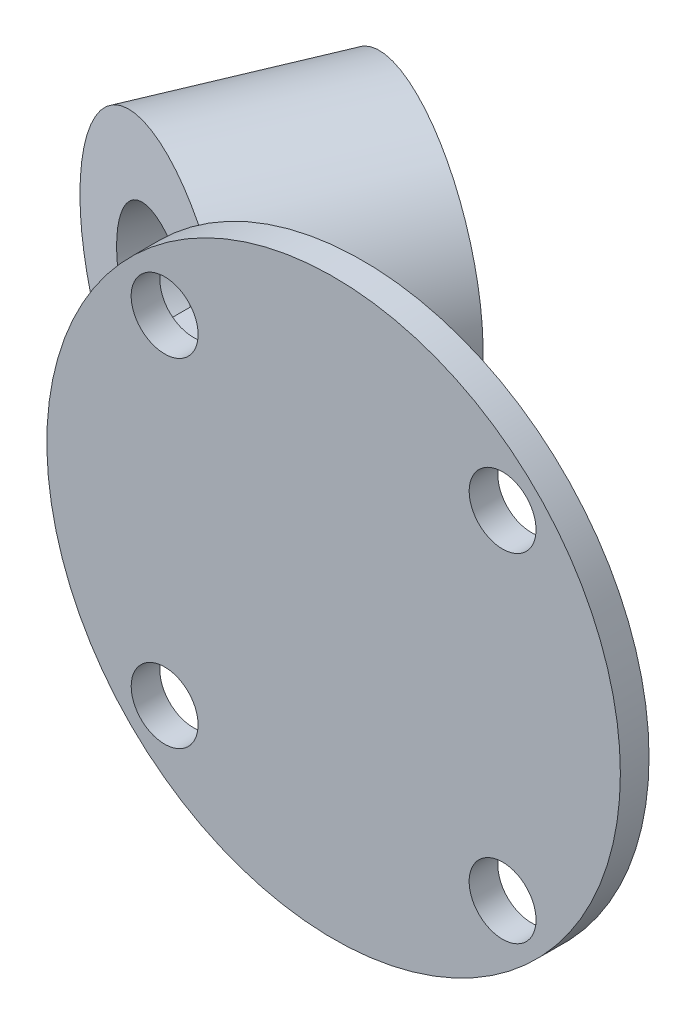
ISO-10303-21;
HEADER;
FILE_DESCRIPTION(('STEP AP214'),'2;1');
FILE_NAME('part.step','',(''),(''),'','','');
FILE_SCHEMA(('AUTOMOTIVE_DESIGN { 1 0 10303 214 1 1 1 1 }'));
ENDSEC;
DATA;
#1=APPLICATION_CONTEXT('core data for automotive mechanical design processes');
#2=APPLICATION_PROTOCOL_DEFINITION('international standard','automotive_design',2000,#1);
#3=PRODUCT_CONTEXT('',#1,'mechanical');
#4=PRODUCT('Part','Part','',(#3));
#5=PRODUCT_RELATED_PRODUCT_CATEGORY('part','',(#4));
#6=PRODUCT_DEFINITION_FORMATION('','',#4);
#7=PRODUCT_DEFINITION_CONTEXT('part definition',#1,'design');
#8=PRODUCT_DEFINITION('design','',#6,#7);
#9=PRODUCT_DEFINITION_SHAPE('','',#8);
#10=(LENGTH_UNIT() NAMED_UNIT(*) SI_UNIT(.MILLI.,.METRE.));
#11=(NAMED_UNIT(*) PLANE_ANGLE_UNIT() SI_UNIT($,.RADIAN.));
#12=(NAMED_UNIT(*) SI_UNIT($,.STERADIAN.) SOLID_ANGLE_UNIT());
#13=UNCERTAINTY_MEASURE_WITH_UNIT(LENGTH_MEASURE(1.E-05),#10,'distance_accuracy_value','');
#14=(GEOMETRIC_REPRESENTATION_CONTEXT(3) GLOBAL_UNCERTAINTY_ASSIGNED_CONTEXT((#13)) GLOBAL_UNIT_ASSIGNED_CONTEXT((#10,
#11,#12)) REPRESENTATION_CONTEXT('',''));
#15=CARTESIAN_POINT('',(0.,0.,0.));
#16=DIRECTION('',(0.,0.,1.));
#17=DIRECTION('',(1.,0.,0.));
#18=AXIS2_PLACEMENT_3D('',#15,#16,#17);
#19=CARTESIAN_POINT('',(-21.1807300401859,5.,-14.1666666666666));
#20=DIRECTION('',(-0.388888888888892,0.,0.92128466398761));
#21=DIRECTION('',(0.92128466398761,0.,0.388888888888892));
#22=AXIS2_PLACEMENT_3D('',#19,#20,#21);
#23=PLANE('',#22);
#24=CARTESIAN_POINT('',(-35.,0.,-20.));
#25=DIRECTION('',(-0.388888888888892,0.,0.92128466398761));
#26=DIRECTION('',(0.92128466398761,0.,0.388888888888892));
#27=AXIS2_PLACEMENT_3D('',#24,#25,#26);
#28=CIRCLE('',#27,15.);
#29=CARTESIAN_POINT('',(-21.1807300401858,0.,-14.1666666666666));
#30=VERTEX_POINT('',#29);
#31=CARTESIAN_POINT('',(-21.9710673338238,-5.,-14.5002805907713));
#32=VERTEX_POINT('',#31);
#33=EDGE_CURVE('E55',#30,#32,#28,.F.);
#34=ORIENTED_EDGE('',*,*,#33,.F.);
#35=DIRECTION('',(0.,-1.,0.));
#36=VECTOR('',#35,1.);
#37=CARTESIAN_POINT('',(-21.1807300401859,5.,-14.1666666666666));
#38=LINE('',#37,#36);
#39=CARTESIAN_POINT('',(-21.1807300401859,-5.,-14.1666666666666));
#40=VERTEX_POINT('',#39);
#41=EDGE_CURVE('E157',#30,#40,#38,.T.);
#42=ORIENTED_EDGE('',*,*,#41,.T.);
#43=DIRECTION('',(-0.92128466398761,0.,-0.388888888888892));
#44=VECTOR('',#43,1.);
#45=CARTESIAN_POINT('',(-21.1807300401859,-5.,-14.1666666666666));
#46=LINE('',#45,#44);
#47=EDGE_CURVE('E147',#40,#32,#46,.T.);
#48=ORIENTED_EDGE('',*,*,#47,.T.);
#49=EDGE_LOOP('',(#34,#42,#48));
#50=FACE_BOUND('',#49,.T.);
#51=ADVANCED_FACE('F39',(#50),#23,.F.);
#52=CARTESIAN_POINT('',(0.,5.,0.));
#53=DIRECTION('',(0.,-1.,0.));
#54=DIRECTION('',(0.,0.,-1.));
#55=AXIS2_PLACEMENT_3D('',#52,#53,#54);
#56=PLANE('',#55);
#57=DIRECTION('',(0.92128466398761,0.,0.388888888888891));
#58=VECTOR('',#57,1.);
#59=CARTESIAN_POINT('',(-0.0721069344173931,5.,0.170822604460897));
#60=LINE('',#59,#58);
#61=CARTESIAN_POINT('',(-29.7584240653411,5.,-12.3602433467286));
#62=VERTEX_POINT('',#61);
#63=CARTESIAN_POINT('',(-23.9155117782683,5.,-9.8938572708332));
#64=VERTEX_POINT('',#63);
#65=EDGE_CURVE('E111',#62,#64,#60,.T.);
#66=ORIENTED_EDGE('',*,*,#65,.F.);
#67=DIRECTION('',(0.,0.,1.));
#68=VECTOR('',#67,1.);
#69=CARTESIAN_POINT('',(-29.7584240653411,5.,-12.3602433467286));
#70=LINE('',#69,#68);
#71=CARTESIAN_POINT('',(-29.7584240653411,5.,0.));
#72=VERTEX_POINT('',#71);
#73=EDGE_CURVE('E143',#62,#72,#70,.T.);
#74=ORIENTED_EDGE('',*,*,#73,.T.);
#75=DIRECTION('',(1.,0.,0.));
#76=VECTOR('',#75,1.);
#77=CARTESIAN_POINT('',(-29.7584240653411,5.,0.));
#78=LINE('',#77,#76);
#79=CARTESIAN_POINT('',(-29.5803989154981,5.,0.));
#80=VERTEX_POINT('',#79);
#81=EDGE_CURVE('E146',#72,#80,#78,.T.);
#82=ORIENTED_EDGE('',*,*,#81,.T.);
#83=CARTESIAN_POINT('',(0.,5.,0.));
#84=VERTEX_POINT('',#83);
#85=EDGE_CURVE('E152',#80,#84,#78,.T.);
#86=ORIENTED_EDGE('',*,*,#85,.T.);
#87=DIRECTION('',(-0.831212911973444,0.,-0.555954220209388));
#88=VECTOR('',#87,1.);
#89=CARTESIAN_POINT('',(0.,5.,0.));
#90=LINE('',#89,#88);
#91=CARTESIAN_POINT('',(-21.1807300401859,5.,-14.1666666666666));
#92=VERTEX_POINT('',#91);
#93=EDGE_CURVE('E151',#84,#92,#90,.T.);
#94=ORIENTED_EDGE('',*,*,#93,.T.);
#95=DIRECTION('',(-0.92128466398761,0.,-0.388888888888892));
#96=VECTOR('',#95,1.);
#97=CARTESIAN_POINT('',(-21.1807300401859,5.,-14.1666666666666));
#98=LINE('',#97,#96);
#99=CARTESIAN_POINT('',(-21.9710673338238,5.,-14.5002805907713));
#100=VERTEX_POINT('',#99);
#101=EDGE_CURVE('E134',#92,#100,#98,.T.);
#102=ORIENTED_EDGE('',*,*,#101,.T.);
#103=DIRECTION('',(0.388888888888891,0.,-0.92128466398761));
#104=VECTOR('',#103,1.);
#105=CARTESIAN_POINT('',(-21.9710673338238,5.,-14.5002805907713));
#106=LINE('',#105,#104);
#107=EDGE_CURVE('E126',#64,#100,#106,.T.);
#108=ORIENTED_EDGE('',*,*,#107,.F.);
#109=EDGE_LOOP('',(#66,#74,#82,#86,#94,#102,#108));
#110=FACE_BOUND('',#109,.T.);
#111=ADVANCED_FACE('F132',(#110),#56,.F.);
#112=CARTESIAN_POINT('',(0.,-5.,0.));
#113=DIRECTION('',(0.,-1.,0.));
#114=DIRECTION('',(0.,0.,-1.));
#115=AXIS2_PLACEMENT_3D('',#112,#113,#114);
#116=PLANE('',#115);
#117=DIRECTION('',(0.,0.,1.));
#118=VECTOR('',#117,1.);
#119=CARTESIAN_POINT('',(-29.7584240653411,-5.,-12.3602433467286));
#120=LINE('',#119,#118);
#121=CARTESIAN_POINT('',(-29.7584240653411,-5.,-12.3602433467286));
#122=VERTEX_POINT('',#121);
#123=CARTESIAN_POINT('',(-29.7584240653411,-5.,0.));
#124=VERTEX_POINT('',#123);
#125=EDGE_CURVE('E122',#122,#124,#120,.T.);
#126=ORIENTED_EDGE('',*,*,#125,.F.);
#127=DIRECTION('',(0.92128466398761,0.,0.388888888888891));
#128=VECTOR('',#127,1.);
#129=CARTESIAN_POINT('',(-0.0721069344173931,-5.,0.170822604460897));
#130=LINE('',#129,#128);
#131=CARTESIAN_POINT('',(-23.9155117782683,-5.,-9.8938572708332));
#132=VERTEX_POINT('',#131);
#133=EDGE_CURVE('E11',#122,#132,#130,.T.);
#134=ORIENTED_EDGE('',*,*,#133,.T.);
#135=DIRECTION('',(0.388888888888891,0.,-0.92128466398761));
#136=VECTOR('',#135,1.);
#137=CARTESIAN_POINT('',(-21.9710673338238,-5.,-14.5002805907713));
#138=LINE('',#137,#136);
#139=EDGE_CURVE('E48',#132,#32,#138,.T.);
#140=ORIENTED_EDGE('',*,*,#139,.T.);
#141=ORIENTED_EDGE('',*,*,#47,.F.);
#142=DIRECTION('',(-0.831212911973444,0.,-0.555954220209388));
#143=VECTOR('',#142,1.);
#144=CARTESIAN_POINT('',(0.,-5.,0.));
#145=LINE('',#144,#143);
#146=CARTESIAN_POINT('',(0.,-5.,0.));
#147=VERTEX_POINT('',#146);
#148=EDGE_CURVE('E164',#147,#40,#145,.T.);
#149=ORIENTED_EDGE('',*,*,#148,.F.);
#150=DIRECTION('',(1.,0.,0.));
#151=VECTOR('',#150,1.);
#152=CARTESIAN_POINT('',(-29.7584240653411,-5.,0.));
#153=LINE('',#152,#151);
#154=CARTESIAN_POINT('',(-29.5803989154981,-5.,0.));
#155=VERTEX_POINT('',#154);
#156=EDGE_CURVE('E165',#155,#147,#153,.T.);
#157=ORIENTED_EDGE('',*,*,#156,.F.);
#158=EDGE_CURVE('E160',#124,#155,#153,.T.);
#159=ORIENTED_EDGE('',*,*,#158,.F.);
#160=EDGE_LOOP('',(#126,#134,#140,#141,#149,#157,#159));
#161=FACE_BOUND('',#160,.T.);
#162=ADVANCED_FACE('F252',(#161),#116,.T.);
#163=CARTESIAN_POINT('',(0.,0.,0.));
#164=DIRECTION('',(0.,0.,1.));
#165=DIRECTION('',(1.,0.,0.));
#166=AXIS2_PLACEMENT_3D('',#163,#164,#165);
#167=PLANE('',#166);
#168=CARTESIAN_POINT('',(-17.6776695296637,17.6776695296637,0.));
#169=DIRECTION('',(0.,0.,1.));
#170=DIRECTION('',(1.,0.,0.));
#171=AXIS2_PLACEMENT_3D('',#168,#169,#170);
#172=CIRCLE('',#171,3.5);
#173=CARTESIAN_POINT('',(-14.1776695296637,17.6776695296637,0.));
#174=VERTEX_POINT('',#173);
#175=EDGE_CURVE('E211',#174,#174,#172,.T.);
#176=ORIENTED_EDGE('',*,*,#175,.T.);
#177=EDGE_LOOP('',(#176));
#178=FACE_BOUND('',#177,.T.);
#179=CARTESIAN_POINT('',(17.6776695296637,17.6776695296637,0.));
#180=DIRECTION('',(0.,0.,1.));
#181=DIRECTION('',(-1.,0.,0.));
#182=AXIS2_PLACEMENT_3D('',#179,#180,#181);
#183=CIRCLE('',#182,3.5);
#184=CARTESIAN_POINT('',(14.1776695296637,17.6776695296637,0.));
#185=VERTEX_POINT('',#184);
#186=EDGE_CURVE('E187',#185,#185,#183,.T.);
#187=ORIENTED_EDGE('',*,*,#186,.T.);
#188=EDGE_LOOP('',(#187));
#189=FACE_BOUND('',#188,.T.);
#190=CARTESIAN_POINT('',(17.6776695296637,-17.6776695296637,0.));
#191=DIRECTION('',(0.,0.,1.));
#192=DIRECTION('',(1.,0.,0.));
#193=AXIS2_PLACEMENT_3D('',#190,#191,#192);
#194=CIRCLE('',#193,3.5);
#195=CARTESIAN_POINT('',(21.1776695296637,-17.6776695296637,0.));
#196=VERTEX_POINT('',#195);
#197=EDGE_CURVE('E196',#196,#196,#194,.T.);
#198=ORIENTED_EDGE('',*,*,#197,.T.);
#199=EDGE_LOOP('',(#198));
#200=FACE_BOUND('',#199,.T.);
#201=CARTESIAN_POINT('',(-17.6776695296637,-17.6776695296637,0.));
#202=DIRECTION('',(0.,0.,1.));
#203=DIRECTION('',(-1.,0.,0.));
#204=AXIS2_PLACEMENT_3D('',#201,#202,#203);
#205=CIRCLE('',#204,3.5);
#206=CARTESIAN_POINT('',(-21.1776695296637,-17.6776695296637,0.));
#207=VERTEX_POINT('',#206);
#208=EDGE_CURVE('E204',#207,#207,#205,.T.);
#209=ORIENTED_EDGE('',*,*,#208,.T.);
#210=EDGE_LOOP('',(#209));
#211=FACE_BOUND('',#210,.T.);
#212=CARTESIAN_POINT('',(0.,0.,0.));
#213=DIRECTION('',(0.,0.,1.));
#214=DIRECTION('',(1.,0.,0.));
#215=AXIS2_PLACEMENT_3D('',#212,#213,#214);
#216=CIRCLE('',#215,30.);
#217=EDGE_CURVE('E215',#155,#80,#216,.T.);
#218=ORIENTED_EDGE('',*,*,#217,.F.);
#219=ORIENTED_EDGE('',*,*,#156,.T.);
#220=DIRECTION('',(0.,-1.,0.));
#221=VECTOR('',#220,1.);
#222=CARTESIAN_POINT('',(0.,5.,0.));
#223=LINE('',#222,#221);
#224=EDGE_CURVE('E176',#84,#147,#223,.T.);
#225=ORIENTED_EDGE('',*,*,#224,.F.);
#226=ORIENTED_EDGE('',*,*,#85,.F.);
#227=EDGE_LOOP('',(#218,#219,#225,#226));
#228=FACE_BOUND('',#227,.T.);
#229=ADVANCED_FACE('F258',(#178,#189,#200,#211,#228),#167,.F.);
#230=CARTESIAN_POINT('',(0.,0.,3.));
#231=DIRECTION('',(0.,0.,-1.));
#232=DIRECTION('',(-1.,0.,0.));
#233=AXIS2_PLACEMENT_3D('',#230,#231,#232);
#234=CYLINDRICAL_SURFACE('',#233,30.);
#235=CARTESIAN_POINT('',(0.,0.,3.));
#236=DIRECTION('',(0.,0.,1.));
#237=DIRECTION('',(1.,0.,0.));
#238=AXIS2_PLACEMENT_3D('',#235,#236,#237);
#239=CIRCLE('',#238,30.);
#240=CARTESIAN_POINT('',(30.,0.,3.));
#241=VERTEX_POINT('',#240);
#242=EDGE_CURVE('E219',#241,#241,#239,.T.);
#243=ORIENTED_EDGE('',*,*,#242,.F.);
#244=EDGE_LOOP('',(#243));
#245=FACE_BOUND('',#244,.T.);
#246=CARTESIAN_POINT('',(-29.7584240653411,3.79949959169974,0.));
#247=VERTEX_POINT('',#246);
#248=EDGE_CURVE('E223',#80,#247,#216,.T.);
#249=ORIENTED_EDGE('',*,*,#248,.T.);
#250=CARTESIAN_POINT('',(-29.7584240653411,-3.79949959169974,0.));
#251=VERTEX_POINT('',#250);
#252=EDGE_CURVE('E226',#247,#251,#216,.T.);
#253=ORIENTED_EDGE('',*,*,#252,.T.);
#254=EDGE_CURVE('E248',#251,#155,#216,.T.);
#255=ORIENTED_EDGE('',*,*,#254,.T.);
#256=ORIENTED_EDGE('',*,*,#217,.T.);
#257=EDGE_LOOP('',(#249,#253,#255,#256));
#258=FACE_BOUND('',#257,.T.);
#259=ADVANCED_FACE('F41',(#245,#258),#234,.T.);
#260=CARTESIAN_POINT('',(0.,0.,3.));
#261=DIRECTION('',(0.,0.,1.));
#262=DIRECTION('',(1.,0.,0.));
#263=AXIS2_PLACEMENT_3D('',#260,#261,#262);
#264=PLANE('',#263);
#265=CARTESIAN_POINT('',(-17.6776695296637,-17.6776695296637,3.));
#266=DIRECTION('',(0.,0.,1.));
#267=DIRECTION('',(-1.,0.,0.));
#268=AXIS2_PLACEMENT_3D('',#265,#266,#267);
#269=CIRCLE('',#268,3.5);
#270=CARTESIAN_POINT('',(-21.1776695296637,-17.6776695296637,3.));
#271=VERTEX_POINT('',#270);
#272=EDGE_CURVE('E186',#271,#271,#269,.T.);
#273=ORIENTED_EDGE('',*,*,#272,.F.);
#274=EDGE_LOOP('',(#273));
#275=FACE_BOUND('',#274,.T.);
#276=CARTESIAN_POINT('',(17.6776695296637,-17.6776695296637,3.));
#277=DIRECTION('',(0.,0.,1.));
#278=DIRECTION('',(1.,0.,0.));
#279=AXIS2_PLACEMENT_3D('',#276,#277,#278);
#280=CIRCLE('',#279,3.5);
#281=CARTESIAN_POINT('',(21.1776695296637,-17.6776695296637,3.));
#282=VERTEX_POINT('',#281);
#283=EDGE_CURVE('E200',#282,#282,#280,.T.);
#284=ORIENTED_EDGE('',*,*,#283,.F.);
#285=EDGE_LOOP('',(#284));
#286=FACE_BOUND('',#285,.T.);
#287=CARTESIAN_POINT('',(17.6776695296637,17.6776695296637,3.));
#288=DIRECTION('',(0.,0.,1.));
#289=DIRECTION('',(-1.,0.,0.));
#290=AXIS2_PLACEMENT_3D('',#287,#288,#289);
#291=CIRCLE('',#290,3.5);
#292=CARTESIAN_POINT('',(14.1776695296637,17.6776695296637,3.));
#293=VERTEX_POINT('',#292);
#294=EDGE_CURVE('E192',#293,#293,#291,.T.);
#295=ORIENTED_EDGE('',*,*,#294,.F.);
#296=EDGE_LOOP('',(#295));
#297=FACE_BOUND('',#296,.T.);
#298=CARTESIAN_POINT('',(-17.6776695296637,17.6776695296637,3.));
#299=DIRECTION('',(0.,0.,1.));
#300=DIRECTION('',(1.,0.,0.));
#301=AXIS2_PLACEMENT_3D('',#298,#299,#300);
#302=CIRCLE('',#301,3.5);
#303=CARTESIAN_POINT('',(-14.1776695296637,17.6776695296637,3.));
#304=VERTEX_POINT('',#303);
#305=EDGE_CURVE('E191',#304,#304,#302,.T.);
#306=ORIENTED_EDGE('',*,*,#305,.F.);
#307=EDGE_LOOP('',(#306));
#308=FACE_BOUND('',#307,.T.);
#309=ORIENTED_EDGE('',*,*,#242,.T.);
#310=EDGE_LOOP('',(#309));
#311=FACE_BOUND('',#310,.T.);
#312=ADVANCED_FACE('F267',(#275,#286,#297,#308,#311),#264,.T.);
#313=ORIENTED_EDGE('',*,*,#252,.F.);
#314=DIRECTION('',(0.,-1.,0.));
#315=VECTOR('',#314,1.);
#316=CARTESIAN_POINT('',(-29.7584240653411,5.,0.));
#317=LINE('',#316,#315);
#318=EDGE_CURVE('E183',#247,#251,#317,.T.);
#319=ORIENTED_EDGE('',*,*,#318,.T.);
#320=EDGE_LOOP('',(#313,#319));
#321=FACE_BOUND('',#320,.T.);
#322=ADVANCED_FACE('F264',(#321),#167,.F.);
#323=CARTESIAN_POINT('',(-17.6776695296637,17.6776695296637,0.));
#324=DIRECTION('',(0.,0.,1.));
#325=DIRECTION('',(1.,0.,0.));
#326=AXIS2_PLACEMENT_3D('',#323,#324,#325);
#327=CYLINDRICAL_SURFACE('',#326,3.5);
#328=ORIENTED_EDGE('',*,*,#175,.F.);
#329=EDGE_LOOP('',(#328));
#330=FACE_BOUND('',#329,.T.);
#331=ORIENTED_EDGE('',*,*,#305,.T.);
#332=EDGE_LOOP('',(#331));
#333=FACE_BOUND('',#332,.T.);
#334=ADVANCED_FACE('F266',(#330,#333),#327,.F.);
#335=CARTESIAN_POINT('',(17.6776695296637,17.6776695296637,0.));
#336=DIRECTION('',(0.,0.,1.));
#337=DIRECTION('',(1.,0.,0.));
#338=AXIS2_PLACEMENT_3D('',#335,#336,#337);
#339=CYLINDRICAL_SURFACE('',#338,3.5);
#340=ORIENTED_EDGE('',*,*,#186,.F.);
#341=EDGE_LOOP('',(#340));
#342=FACE_BOUND('',#341,.T.);
#343=ORIENTED_EDGE('',*,*,#294,.T.);
#344=EDGE_LOOP('',(#343));
#345=FACE_BOUND('',#344,.T.);
#346=ADVANCED_FACE('F272',(#342,#345),#339,.F.);
#347=CARTESIAN_POINT('',(17.6776695296637,-17.6776695296637,0.));
#348=DIRECTION('',(0.,0.,1.));
#349=DIRECTION('',(1.,0.,0.));
#350=AXIS2_PLACEMENT_3D('',#347,#348,#349);
#351=CYLINDRICAL_SURFACE('',#350,3.5);
#352=ORIENTED_EDGE('',*,*,#197,.F.);
#353=EDGE_LOOP('',(#352));
#354=FACE_BOUND('',#353,.T.);
#355=ORIENTED_EDGE('',*,*,#283,.T.);
#356=EDGE_LOOP('',(#355));
#357=FACE_BOUND('',#356,.T.);
#358=ADVANCED_FACE('F323',(#354,#357),#351,.F.);
#359=CARTESIAN_POINT('',(-17.6776695296637,-17.6776695296637,0.));
#360=DIRECTION('',(0.,0.,1.));
#361=DIRECTION('',(1.,0.,0.));
#362=AXIS2_PLACEMENT_3D('',#359,#360,#361);
#363=CYLINDRICAL_SURFACE('',#362,3.5);
#364=ORIENTED_EDGE('',*,*,#208,.F.);
#365=EDGE_LOOP('',(#364));
#366=FACE_BOUND('',#365,.T.);
#367=ORIENTED_EDGE('',*,*,#272,.T.);
#368=EDGE_LOOP('',(#367));
#369=FACE_BOUND('',#368,.T.);
#370=ADVANCED_FACE('F316',(#366,#369),#363,.F.);
#371=CARTESIAN_POINT('',(-29.7584240653411,5.,0.));
#372=DIRECTION('',(0.,0.,-1.));
#373=DIRECTION('',(-1.,0.,0.));
#374=AXIS2_PLACEMENT_3D('',#371,#372,#373);
#375=PLANE('',#374);
#376=ORIENTED_EDGE('',*,*,#248,.F.);
#377=ORIENTED_EDGE('',*,*,#81,.F.);
#378=EDGE_CURVE('E179',#72,#247,#317,.T.);
#379=ORIENTED_EDGE('',*,*,#378,.T.);
#380=EDGE_LOOP('',(#376,#377,#379));
#381=FACE_BOUND('',#380,.T.);
#382=ADVANCED_FACE('F314',(#381),#375,.F.);
#383=CARTESIAN_POINT('',(-29.7584240653411,5.,-12.3602433467286));
#384=DIRECTION('',(1.,0.,0.));
#385=DIRECTION('',(0.,0.,-1.));
#386=AXIS2_PLACEMENT_3D('',#383,#384,#385);
#387=PLANE('',#386);
#388=ORIENTED_EDGE('',*,*,#125,.T.);
#389=EDGE_CURVE('E63',#251,#124,#317,.T.);
#390=ORIENTED_EDGE('',*,*,#389,.F.);
#391=ORIENTED_EDGE('',*,*,#318,.F.);
#392=ORIENTED_EDGE('',*,*,#378,.F.);
#393=ORIENTED_EDGE('',*,*,#73,.F.);
#394=DIRECTION('',(0.,-1.,0.));
#395=VECTOR('',#394,1.);
#396=CARTESIAN_POINT('',(-29.7584240653411,5.,-12.3602433467286));
#397=LINE('',#396,#395);
#398=CARTESIAN_POINT('',(-29.7584240653411,0.,-12.3602433467286));
#399=VERTEX_POINT('',#398);
#400=EDGE_CURVE('E117',#62,#399,#397,.T.);
#401=ORIENTED_EDGE('',*,*,#400,.T.);
#402=DIRECTION('',(0.,1.,0.));
#403=VECTOR('',#402,1.);
#404=CARTESIAN_POINT('',(-29.7584240653411,5.,-12.3602433467286));
#405=LINE('',#404,#403);
#406=EDGE_CURVE('E123',#122,#399,#405,.T.);
#407=ORIENTED_EDGE('',*,*,#406,.F.);
#408=EDGE_LOOP('',(#388,#390,#391,#392,#393,#401,#407));
#409=FACE_BOUND('',#408,.T.);
#410=ADVANCED_FACE('F251',(#409),#387,.F.);
#411=ORIENTED_EDGE('',*,*,#254,.F.);
#412=ORIENTED_EDGE('',*,*,#389,.T.);
#413=ORIENTED_EDGE('',*,*,#158,.T.);
#414=EDGE_LOOP('',(#411,#412,#413));
#415=FACE_BOUND('',#414,.T.);
#416=ADVANCED_FACE('F245',(#415),#375,.F.);
#417=CARTESIAN_POINT('',(0.,5.,0.));
#418=DIRECTION('',(-0.555954220209388,0.,0.831212911973444));
#419=DIRECTION('',(0.831212911973444,0.,0.555954220209388));
#420=AXIS2_PLACEMENT_3D('',#417,#418,#419);
#421=PLANE('',#420);
#422=ORIENTED_EDGE('',*,*,#148,.T.);
#423=ORIENTED_EDGE('',*,*,#41,.F.);
#424=EDGE_CURVE('E172',#92,#30,#38,.T.);
#425=ORIENTED_EDGE('',*,*,#424,.F.);
#426=ORIENTED_EDGE('',*,*,#93,.F.);
#427=ORIENTED_EDGE('',*,*,#224,.T.);
#428=EDGE_LOOP('',(#422,#423,#425,#426,#427));
#429=FACE_BOUND('',#428,.T.);
#430=ADVANCED_FACE('F256',(#429),#421,.F.);
#431=EDGE_CURVE('E136',#100,#30,#28,.F.);
#432=ORIENTED_EDGE('',*,*,#431,.F.);
#433=ORIENTED_EDGE('',*,*,#101,.F.);
#434=ORIENTED_EDGE('',*,*,#424,.T.);
#435=EDGE_LOOP('',(#432,#433,#434));
#436=FACE_BOUND('',#435,.T.);
#437=ADVANCED_FACE('F282',(#436),#23,.F.);
#438=CARTESIAN_POINT('',(-29.7584240653411,0.,-12.3602433467286));
#439=DIRECTION('',(0.388888888888891,0.,-0.92128466398761));
#440=DIRECTION('',(-0.92128466398761,0.,-0.388888888888891));
#441=AXIS2_PLACEMENT_3D('',#438,#439,#440);
#442=PLANE('',#441);
#443=ORIENTED_EDGE('',*,*,#400,.F.);
#444=ORIENTED_EDGE('',*,*,#65,.T.);
#445=CARTESIAN_POINT('',(-36.9444444444445,0.,-15.3935766800619));
#446=DIRECTION('',(0.388888888888891,0.,-0.92128466398761));
#447=DIRECTION('',(-0.92128466398761,0.,-0.388888888888891));
#448=AXIS2_PLACEMENT_3D('',#445,#446,#447);
#449=CIRCLE('',#448,15.);
#450=EDGE_CURVE('E114',#132,#64,#449,.T.);
#451=ORIENTED_EDGE('',*,*,#450,.F.);
#452=ORIENTED_EDGE('',*,*,#133,.F.);
#453=ORIENTED_EDGE('',*,*,#406,.T.);
#454=CARTESIAN_POINT('',(-36.9444444444445,0.,-15.3935766800619));
#455=DIRECTION('',(0.388888888888891,0.,-0.92128466398761));
#456=DIRECTION('',(-0.92128466398761,0.,-0.388888888888891));
#457=AXIS2_PLACEMENT_3D('',#454,#455,#456);
#458=CIRCLE('',#457,7.79999999999999);
#459=EDGE_CURVE('E304',#399,#399,#458,.T.);
#460=ORIENTED_EDGE('',*,*,#459,.T.);
#461=EDGE_LOOP('',(#443,#444,#451,#452,#453,#460));
#462=FACE_BOUND('',#461,.T.);
#463=ADVANCED_FACE('F113',(#462),#442,.F.);
#464=CARTESIAN_POINT('',(-35.,0.,-20.));
#465=DIRECTION('',(0.388888888888891,0.,-0.92128466398761));
#466=DIRECTION('',(-0.92128466398761,0.,-0.388888888888891));
#467=AXIS2_PLACEMENT_3D('',#464,#465,#466);
#468=CYLINDRICAL_SURFACE('',#467,15.);
#469=CARTESIAN_POINT('',(-29.1666666666666,0.,-33.8192699598141));
#470=DIRECTION('',(0.388888888888891,0.,-0.92128466398761));
#471=DIRECTION('',(-0.92128466398761,0.,-0.388888888888891));
#472=AXIS2_PLACEMENT_3D('',#469,#470,#471);
#473=CIRCLE('',#472,15.);
#474=CARTESIAN_POINT('',(-42.9859366264808,0.,-39.6526032931475));
#475=VERTEX_POINT('',#474);
#476=EDGE_CURVE('E129',#475,#475,#473,.T.);
#477=ORIENTED_EDGE('',*,*,#476,.F.);
#478=EDGE_LOOP('',(#477));
#479=FACE_BOUND('',#478,.T.);
#480=ORIENTED_EDGE('',*,*,#450,.T.);
#481=ORIENTED_EDGE('',*,*,#107,.T.);
#482=ORIENTED_EDGE('',*,*,#431,.T.);
#483=ORIENTED_EDGE('',*,*,#33,.T.);
#484=ORIENTED_EDGE('',*,*,#139,.F.);
#485=EDGE_LOOP('',(#480,#481,#482,#483,#484));
#486=FACE_BOUND('',#485,.T.);
#487=ADVANCED_FACE('F125',(#479,#486),#468,.T.);
#488=CARTESIAN_POINT('',(-15.3473967068525,0.,-27.9859366264808));
#489=DIRECTION('',(-0.388888888888891,0.,0.92128466398761));
#490=DIRECTION('',(0.92128466398761,0.,0.388888888888891));
#491=AXIS2_PLACEMENT_3D('',#488,#489,#490);
#492=PLANE('',#491);
#493=CARTESIAN_POINT('',(-29.1666666666666,0.,-33.8192699598142));
#494=DIRECTION('',(0.388888888888891,0.,-0.92128466398761));
#495=DIRECTION('',(-0.92128466398761,0.,-0.388888888888891));
#496=AXIS2_PLACEMENT_3D('',#493,#494,#495);
#497=CIRCLE('',#496,8.34558700000001);
#498=CARTESIAN_POINT('',(-36.855327981741,0.,-37.0647760153697));
#499=VERTEX_POINT('',#498);
#500=EDGE_CURVE('E300',#499,#499,#497,.T.);
#501=ORIENTED_EDGE('',*,*,#500,.F.);
#502=EDGE_LOOP('',(#501));
#503=FACE_BOUND('',#502,.T.);
#504=ORIENTED_EDGE('',*,*,#476,.T.);
#505=EDGE_LOOP('',(#504));
#506=FACE_BOUND('',#505,.T.);
#507=ADVANCED_FACE('F355',(#503,#506),#492,.F.);
#508=CARTESIAN_POINT('',(-29.1666666666666,0.,-33.8192699598142));
#509=DIRECTION('',(0.388888888888891,0.,-0.92128466398761));
#510=DIRECTION('',(-0.92128466398761,0.,-0.388888888888891));
#511=AXIS2_PLACEMENT_3D('',#508,#509,#510);
#512=CONICAL_SURFACE('',#511,8.345587,0.027272586259339);
#513=ORIENTED_EDGE('',*,*,#459,.F.);
#514=EDGE_LOOP('',(#513));
#515=FACE_BOUND('',#514,.T.);
#516=ORIENTED_EDGE('',*,*,#500,.T.);
#517=EDGE_LOOP('',(#516));
#518=FACE_BOUND('',#517,.T.);
#519=ADVANCED_FACE('F309',(#515,#518),#512,.F.);
#520=CLOSED_SHELL('',(#51,#111,#162,#229,#259,#312,#322,#334,#346,#358,#370,#382,#410,#416,#430,
#437,#463,#487,#507,#519));
#521=MANIFOLD_SOLID_BREP('B2',#520);
#522=ADVANCED_BREP_SHAPE_REPRESENTATION('',(#18,#521),#14);
#523=SHAPE_DEFINITION_REPRESENTATION(#9,#522);
ENDSEC;
END-ISO-10303-21;
